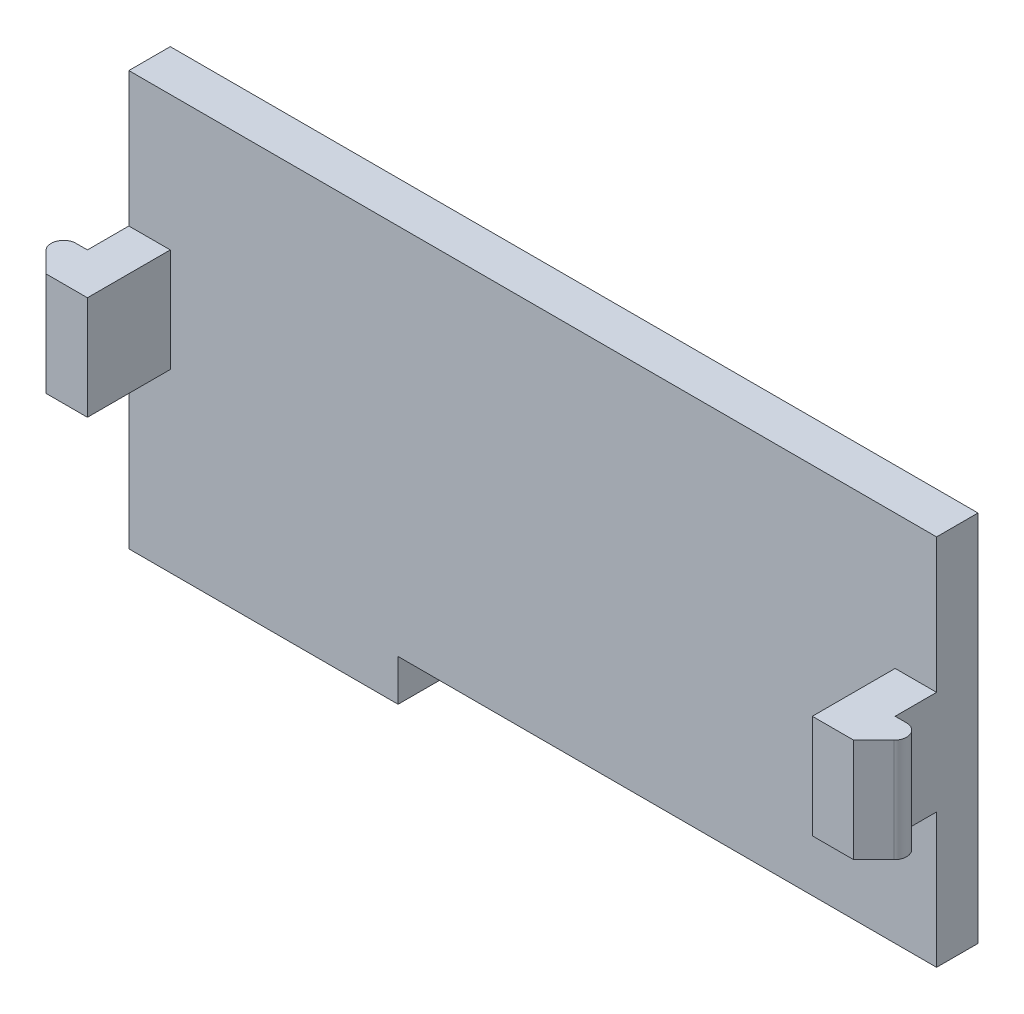
ISO-10303-21;
HEADER;
FILE_DESCRIPTION(('STEP AP214'),'2;1');
FILE_NAME('part.step','',(''),(''),'','','');
FILE_SCHEMA(('AUTOMOTIVE_DESIGN { 1 0 10303 214 1 1 1 1 }'));
ENDSEC;
DATA;
#1=APPLICATION_CONTEXT('core data for automotive mechanical design processes');
#2=APPLICATION_PROTOCOL_DEFINITION('international standard','automotive_design',2000,#1);
#3=PRODUCT_CONTEXT('',#1,'mechanical');
#4=PRODUCT('Part','Part','',(#3));
#5=PRODUCT_RELATED_PRODUCT_CATEGORY('part','',(#4));
#6=PRODUCT_DEFINITION_FORMATION('','',#4);
#7=PRODUCT_DEFINITION_CONTEXT('part definition',#1,'design');
#8=PRODUCT_DEFINITION('design','',#6,#7);
#9=PRODUCT_DEFINITION_SHAPE('','',#8);
#10=(LENGTH_UNIT() NAMED_UNIT(*) SI_UNIT(.MILLI.,.METRE.));
#11=(NAMED_UNIT(*) PLANE_ANGLE_UNIT() SI_UNIT($,.RADIAN.));
#12=(NAMED_UNIT(*) SI_UNIT($,.STERADIAN.) SOLID_ANGLE_UNIT());
#13=UNCERTAINTY_MEASURE_WITH_UNIT(LENGTH_MEASURE(1.E-05),#10,'distance_accuracy_value','');
#14=(GEOMETRIC_REPRESENTATION_CONTEXT(3) GLOBAL_UNCERTAINTY_ASSIGNED_CONTEXT((#13)) GLOBAL_UNIT_ASSIGNED_CONTEXT((#10,
#11,#12)) REPRESENTATION_CONTEXT('',''));
#15=CARTESIAN_POINT('',(0.,0.,0.));
#16=DIRECTION('',(0.,0.,1.));
#17=DIRECTION('',(1.,0.,0.));
#18=AXIS2_PLACEMENT_3D('',#15,#16,#17);
#19=CARTESIAN_POINT('',(0.,0.,2.));
#20=DIRECTION('',(0.,0.,1.));
#21=DIRECTION('',(1.,0.,0.));
#22=AXIS2_PLACEMENT_3D('',#19,#20,#21);
#23=PLANE('',#22);
#24=DIRECTION('',(0.,1.,0.));
#25=VECTOR('',#24,1.);
#26=CARTESIAN_POINT('',(14.,-20.,2.));
#27=LINE('',#26,#25);
#28=CARTESIAN_POINT('',(14.,-20.,2.));
#29=VERTEX_POINT('',#28);
#30=CARTESIAN_POINT('',(14.,-18.,2.));
#31=VERTEX_POINT('',#30);
#32=EDGE_CURVE('E177',#29,#31,#27,.T.);
#33=ORIENTED_EDGE('',*,*,#32,.T.);
#34=DIRECTION('',(1.,0.,0.));
#35=VECTOR('',#34,1.);
#36=CARTESIAN_POINT('',(0.,-18.,2.));
#37=LINE('',#36,#35);
#38=CARTESIAN_POINT('',(40.,-18.,2.));
#39=VERTEX_POINT('',#38);
#40=EDGE_CURVE('E54',#31,#39,#37,.T.);
#41=ORIENTED_EDGE('',*,*,#40,.T.);
#42=DIRECTION('',(0.,1.,0.));
#43=VECTOR('',#42,1.);
#44=CARTESIAN_POINT('',(40.,0.,2.));
#45=LINE('',#44,#43);
#46=CARTESIAN_POINT('',(40.,-11.5,2.));
#47=VERTEX_POINT('',#46);
#48=EDGE_CURVE('E299',#39,#47,#45,.T.);
#49=ORIENTED_EDGE('',*,*,#48,.T.);
#50=DIRECTION('',(1.,0.,0.));
#51=VECTOR('',#50,1.);
#52=CARTESIAN_POINT('',(40.,-11.5,2.));
#53=LINE('',#52,#51);
#54=CARTESIAN_POINT('',(38.,-11.5,2.));
#55=VERTEX_POINT('',#54);
#56=EDGE_CURVE('E262',#55,#47,#53,.T.);
#57=ORIENTED_EDGE('',*,*,#56,.F.);
#58=DIRECTION('',(0.,-1.,0.));
#59=VECTOR('',#58,1.);
#60=CARTESIAN_POINT('',(38.,-6.5,2.));
#61=LINE('',#60,#59);
#62=CARTESIAN_POINT('',(38.,-6.5,2.));
#63=VERTEX_POINT('',#62);
#64=EDGE_CURVE('E265',#63,#55,#61,.T.);
#65=ORIENTED_EDGE('',*,*,#64,.F.);
#66=DIRECTION('',(-1.,0.,0.));
#67=VECTOR('',#66,1.);
#68=CARTESIAN_POINT('',(40.,-6.5,2.));
#69=LINE('',#68,#67);
#70=CARTESIAN_POINT('',(40.,-6.5,2.));
#71=VERTEX_POINT('',#70);
#72=EDGE_CURVE('E268',#71,#63,#69,.T.);
#73=ORIENTED_EDGE('',*,*,#72,.F.);
#74=CARTESIAN_POINT('',(40.,0.,2.));
#75=VERTEX_POINT('',#74);
#76=EDGE_CURVE('E297',#71,#75,#45,.T.);
#77=ORIENTED_EDGE('',*,*,#76,.T.);
#78=DIRECTION('',(-1.,0.,0.));
#79=VECTOR('',#78,1.);
#80=CARTESIAN_POINT('',(0.,0.,2.));
#81=LINE('',#80,#79);
#82=CARTESIAN_POINT('',(1.,0.,2.));
#83=VERTEX_POINT('',#82);
#84=EDGE_CURVE('E301',#75,#83,#81,.T.);
#85=ORIENTED_EDGE('',*,*,#84,.T.);
#86=DIRECTION('',(0.,1.,0.));
#87=VECTOR('',#86,1.);
#88=CARTESIAN_POINT('',(1.,0.,2.));
#89=LINE('',#88,#87);
#90=CARTESIAN_POINT('',(1.,-6.5,2.));
#91=VERTEX_POINT('',#90);
#92=EDGE_CURVE('E201',#91,#83,#89,.T.);
#93=ORIENTED_EDGE('',*,*,#92,.F.);
#94=DIRECTION('',(-1.,0.,0.));
#95=VECTOR('',#94,1.);
#96=CARTESIAN_POINT('',(1.,-6.5,2.));
#97=LINE('',#96,#95);
#98=CARTESIAN_POINT('',(3.,-6.5,2.));
#99=VERTEX_POINT('',#98);
#100=EDGE_CURVE('E278',#99,#91,#97,.T.);
#101=ORIENTED_EDGE('',*,*,#100,.F.);
#102=DIRECTION('',(0.,1.,0.));
#103=VECTOR('',#102,1.);
#104=CARTESIAN_POINT('',(3.,-6.5,2.));
#105=LINE('',#104,#103);
#106=CARTESIAN_POINT('',(3.,-11.5,2.));
#107=VERTEX_POINT('',#106);
#108=EDGE_CURVE('E280',#107,#99,#105,.T.);
#109=ORIENTED_EDGE('',*,*,#108,.F.);
#110=DIRECTION('',(1.,0.,0.));
#111=VECTOR('',#110,1.);
#112=CARTESIAN_POINT('',(1.,-11.5,2.));
#113=LINE('',#112,#111);
#114=CARTESIAN_POINT('',(1.,-11.5,2.));
#115=VERTEX_POINT('',#114);
#116=EDGE_CURVE('E271',#115,#107,#113,.T.);
#117=ORIENTED_EDGE('',*,*,#116,.F.);
#118=CARTESIAN_POINT('',(1.,-20.,2.));
#119=VERTEX_POINT('',#118);
#120=EDGE_CURVE('E179',#119,#115,#89,.T.);
#121=ORIENTED_EDGE('',*,*,#120,.F.);
#122=DIRECTION('',(-1.,0.,0.));
#123=VECTOR('',#122,1.);
#124=CARTESIAN_POINT('',(0.,-20.,2.));
#125=LINE('',#124,#123);
#126=EDGE_CURVE('E174',#29,#119,#125,.T.);
#127=ORIENTED_EDGE('',*,*,#126,.F.);
#128=EDGE_LOOP('',(#33,#41,#49,#57,#65,#73,#77,#85,#93,#101,#109,#117,#121,#127));
#129=FACE_BOUND('',#128,.T.);
#130=ADVANCED_FACE('F39',(#129),#23,.T.);
#131=CARTESIAN_POINT('',(0.,-18.,2.));
#132=DIRECTION('',(0.,1.,0.));
#133=DIRECTION('',(0.,0.,1.));
#134=AXIS2_PLACEMENT_3D('',#131,#132,#133);
#135=PLANE('',#134);
#136=ORIENTED_EDGE('',*,*,#40,.F.);
#137=DIRECTION('',(0.,0.,1.));
#138=VECTOR('',#137,1.);
#139=CARTESIAN_POINT('',(14.,-18.,-2.23606797749979));
#140=LINE('',#139,#138);
#141=CARTESIAN_POINT('',(14.,-18.,0.));
#142=VERTEX_POINT('',#141);
#143=EDGE_CURVE('E58',#142,#31,#140,.T.);
#144=ORIENTED_EDGE('',*,*,#143,.F.);
#145=DIRECTION('',(1.,0.,0.));
#146=VECTOR('',#145,1.);
#147=CARTESIAN_POINT('',(0.,-18.,0.));
#148=LINE('',#147,#146);
#149=CARTESIAN_POINT('',(40.,-18.,0.));
#150=VERTEX_POINT('',#149);
#151=EDGE_CURVE('E295',#142,#150,#148,.T.);
#152=ORIENTED_EDGE('',*,*,#151,.T.);
#153=DIRECTION('',(0.,0.,-1.));
#154=VECTOR('',#153,1.);
#155=CARTESIAN_POINT('',(40.,-18.,2.));
#156=LINE('',#155,#154);
#157=EDGE_CURVE('E312',#39,#150,#156,.T.);
#158=ORIENTED_EDGE('',*,*,#157,.F.);
#159=EDGE_LOOP('',(#136,#144,#152,#158));
#160=FACE_BOUND('',#159,.T.);
#161=ADVANCED_FACE('F373',(#160),#135,.F.);
#162=CARTESIAN_POINT('',(40.,0.,2.));
#163=DIRECTION('',(-1.,0.,0.));
#164=DIRECTION('',(0.,0.,1.));
#165=AXIS2_PLACEMENT_3D('',#162,#163,#164);
#166=PLANE('',#165);
#167=DIRECTION('',(0.,1.,0.));
#168=VECTOR('',#167,1.);
#169=CARTESIAN_POINT('',(40.,0.,0.));
#170=LINE('',#169,#168);
#171=CARTESIAN_POINT('',(40.,0.,0.));
#172=VERTEX_POINT('',#171);
#173=EDGE_CURVE('E306',#150,#172,#170,.T.);
#174=ORIENTED_EDGE('',*,*,#173,.T.);
#175=DIRECTION('',(0.,0.,-1.));
#176=VECTOR('',#175,1.);
#177=CARTESIAN_POINT('',(40.,0.,2.));
#178=LINE('',#177,#176);
#179=EDGE_CURVE('E304',#75,#172,#178,.T.);
#180=ORIENTED_EDGE('',*,*,#179,.F.);
#181=ORIENTED_EDGE('',*,*,#76,.F.);
#182=DIRECTION('',(0.,0.,-1.));
#183=VECTOR('',#182,1.);
#184=CARTESIAN_POINT('',(40.,-6.5,4.));
#185=LINE('',#184,#183);
#186=CARTESIAN_POINT('',(40.,-6.5,4.));
#187=VERTEX_POINT('',#186);
#188=EDGE_CURVE('E238',#187,#71,#185,.T.);
#189=ORIENTED_EDGE('',*,*,#188,.F.);
#190=DIRECTION('',(0.,1.,0.));
#191=VECTOR('',#190,1.);
#192=CARTESIAN_POINT('',(40.,-6.5,4.));
#193=LINE('',#192,#191);
#194=CARTESIAN_POINT('',(40.,-11.5,4.));
#195=VERTEX_POINT('',#194);
#196=EDGE_CURVE('E261',#195,#187,#193,.T.);
#197=ORIENTED_EDGE('',*,*,#196,.F.);
#198=DIRECTION('',(0.,0.,-1.));
#199=VECTOR('',#198,1.);
#200=CARTESIAN_POINT('',(40.,-11.5,4.));
#201=LINE('',#200,#199);
#202=EDGE_CURVE('E258',#195,#47,#201,.T.);
#203=ORIENTED_EDGE('',*,*,#202,.T.);
#204=ORIENTED_EDGE('',*,*,#48,.F.);
#205=ORIENTED_EDGE('',*,*,#157,.T.);
#206=EDGE_LOOP('',(#174,#180,#181,#189,#197,#203,#204,#205));
#207=FACE_BOUND('',#206,.T.);
#208=ADVANCED_FACE('F380',(#207),#166,.F.);
#209=CARTESIAN_POINT('',(0.,0.,2.));
#210=DIRECTION('',(0.,-1.,0.));
#211=DIRECTION('',(0.,0.,-1.));
#212=AXIS2_PLACEMENT_3D('',#209,#210,#211);
#213=PLANE('',#212);
#214=DIRECTION('',(-1.,0.,0.));
#215=VECTOR('',#214,1.);
#216=CARTESIAN_POINT('',(0.,0.,0.));
#217=LINE('',#216,#215);
#218=CARTESIAN_POINT('',(1.,0.,0.));
#219=VERTEX_POINT('',#218);
#220=EDGE_CURVE('E298',#172,#219,#217,.T.);
#221=ORIENTED_EDGE('',*,*,#220,.T.);
#222=DIRECTION('',(0.,0.,1.));
#223=VECTOR('',#222,1.);
#224=CARTESIAN_POINT('',(1.,0.,-8.));
#225=LINE('',#224,#223);
#226=EDGE_CURVE('E200',#219,#83,#225,.T.);
#227=ORIENTED_EDGE('',*,*,#226,.T.);
#228=ORIENTED_EDGE('',*,*,#84,.F.);
#229=ORIENTED_EDGE('',*,*,#179,.T.);
#230=EDGE_LOOP('',(#221,#227,#228,#229));
#231=FACE_BOUND('',#230,.T.);
#232=ADVANCED_FACE('F387',(#231),#213,.F.);
#233=CARTESIAN_POINT('',(0.,0.,0.));
#234=DIRECTION('',(0.,0.,1.));
#235=DIRECTION('',(1.,0.,0.));
#236=AXIS2_PLACEMENT_3D('',#233,#234,#235);
#237=PLANE('',#236);
#238=ORIENTED_EDGE('',*,*,#151,.F.);
#239=DIRECTION('',(0.,-1.,0.));
#240=VECTOR('',#239,1.);
#241=CARTESIAN_POINT('',(14.,-20.,0.));
#242=LINE('',#241,#240);
#243=CARTESIAN_POINT('',(14.,-20.,0.));
#244=VERTEX_POINT('',#243);
#245=EDGE_CURVE('E197',#142,#244,#242,.T.);
#246=ORIENTED_EDGE('',*,*,#245,.T.);
#247=DIRECTION('',(-1.,0.,0.));
#248=VECTOR('',#247,1.);
#249=CARTESIAN_POINT('',(0.,-20.,0.));
#250=LINE('',#249,#248);
#251=CARTESIAN_POINT('',(1.,-20.,0.));
#252=VERTEX_POINT('',#251);
#253=EDGE_CURVE('E183',#244,#252,#250,.T.);
#254=ORIENTED_EDGE('',*,*,#253,.T.);
#255=DIRECTION('',(0.,1.,0.));
#256=VECTOR('',#255,1.);
#257=CARTESIAN_POINT('',(1.,0.,0.));
#258=LINE('',#257,#256);
#259=EDGE_CURVE('E204',#252,#219,#258,.T.);
#260=ORIENTED_EDGE('',*,*,#259,.T.);
#261=ORIENTED_EDGE('',*,*,#220,.F.);
#262=ORIENTED_EDGE('',*,*,#173,.F.);
#263=EDGE_LOOP('',(#238,#246,#254,#260,#261,#262));
#264=FACE_BOUND('',#263,.T.);
#265=ADVANCED_FACE('F385',(#264),#237,.F.);
#266=CARTESIAN_POINT('',(1.,-6.5,4.));
#267=DIRECTION('',(1.,0.,0.));
#268=DIRECTION('',(0.,1.,0.));
#269=AXIS2_PLACEMENT_3D('',#266,#267,#268);
#270=PLANE('',#269);
#271=DIRECTION('',(0.,0.,-1.));
#272=VECTOR('',#271,1.);
#273=CARTESIAN_POINT('',(1.,-6.5,4.));
#274=LINE('',#273,#272);
#275=CARTESIAN_POINT('',(1.,-6.5,4.));
#276=VERTEX_POINT('',#275);
#277=EDGE_CURVE('E277',#276,#91,#274,.T.);
#278=ORIENTED_EDGE('',*,*,#277,.T.);
#279=ORIENTED_EDGE('',*,*,#92,.T.);
#280=ORIENTED_EDGE('',*,*,#226,.F.);
#281=ORIENTED_EDGE('',*,*,#259,.F.);
#282=DIRECTION('',(0.,0.,1.));
#283=VECTOR('',#282,1.);
#284=CARTESIAN_POINT('',(1.,-20.,15.1529464379659));
#285=LINE('',#284,#283);
#286=EDGE_CURVE('E11',#252,#119,#285,.T.);
#287=ORIENTED_EDGE('',*,*,#286,.T.);
#288=ORIENTED_EDGE('',*,*,#120,.T.);
#289=DIRECTION('',(0.,0.,-1.));
#290=VECTOR('',#289,1.);
#291=CARTESIAN_POINT('',(1.,-11.5,4.));
#292=LINE('',#291,#290);
#293=CARTESIAN_POINT('',(1.,-11.5,4.));
#294=VERTEX_POINT('',#293);
#295=EDGE_CURVE('E292',#294,#115,#292,.T.);
#296=ORIENTED_EDGE('',*,*,#295,.F.);
#297=DIRECTION('',(0.,-1.,0.));
#298=VECTOR('',#297,1.);
#299=CARTESIAN_POINT('',(1.,-6.5,4.));
#300=LINE('',#299,#298);
#301=EDGE_CURVE('E274',#276,#294,#300,.T.);
#302=ORIENTED_EDGE('',*,*,#301,.F.);
#303=EDGE_LOOP('',(#278,#279,#280,#281,#287,#288,#296,#302));
#304=FACE_BOUND('',#303,.T.);
#305=ADVANCED_FACE('F351',(#304),#270,.F.);
#306=CARTESIAN_POINT('',(1.,-11.5,4.));
#307=DIRECTION('',(0.,1.,0.));
#308=DIRECTION('',(0.,0.,1.));
#309=AXIS2_PLACEMENT_3D('',#306,#307,#308);
#310=PLANE('',#309);
#311=DIRECTION('',(-0.707106781186548,0.,-0.707106781186547));
#312=VECTOR('',#311,1.);
#313=CARTESIAN_POINT('',(-0.999999999999996,-11.5,4.));
#314=LINE('',#313,#312);
#315=CARTESIAN_POINT('',(1.,-11.5,6.));
#316=VERTEX_POINT('',#315);
#317=CARTESIAN_POINT('',(0.0242640687119315,-11.5,5.02426406871193));
#318=VERTEX_POINT('',#317);
#319=EDGE_CURVE('E241',#316,#318,#314,.T.);
#320=ORIENTED_EDGE('',*,*,#319,.T.);
#321=CARTESIAN_POINT('',(0.44852813742386,-11.5,4.6));
#322=DIRECTION('',(0.,1.,0.));
#323=DIRECTION('',(0.,0.,1.));
#324=AXIS2_PLACEMENT_3D('',#321,#322,#323);
#325=CIRCLE('',#324,0.6);
#326=CARTESIAN_POINT('',(0.448528137423859,-11.5,4.));
#327=VERTEX_POINT('',#326);
#328=EDGE_CURVE('E327',#318,#327,#325,.F.);
#329=ORIENTED_EDGE('',*,*,#328,.T.);
#330=DIRECTION('',(1.,0.,0.));
#331=VECTOR('',#330,1.);
#332=CARTESIAN_POINT('',(0.,-11.5,4.));
#333=LINE('',#332,#331);
#334=EDGE_CURVE('E244',#327,#294,#333,.T.);
#335=ORIENTED_EDGE('',*,*,#334,.T.);
#336=ORIENTED_EDGE('',*,*,#295,.T.);
#337=ORIENTED_EDGE('',*,*,#116,.T.);
#338=DIRECTION('',(0.,0.,-1.));
#339=VECTOR('',#338,1.);
#340=CARTESIAN_POINT('',(3.,-11.5,4.));
#341=LINE('',#340,#339);
#342=CARTESIAN_POINT('',(3.,-11.5,6.));
#343=VERTEX_POINT('',#342);
#344=EDGE_CURVE('E289',#343,#107,#341,.T.);
#345=ORIENTED_EDGE('',*,*,#344,.F.);
#346=DIRECTION('',(-1.,0.,0.));
#347=VECTOR('',#346,1.);
#348=CARTESIAN_POINT('',(1.,-11.5,6.));
#349=LINE('',#348,#347);
#350=EDGE_CURVE('E225',#343,#316,#349,.T.);
#351=ORIENTED_EDGE('',*,*,#350,.T.);
#352=EDGE_LOOP('',(#320,#329,#335,#336,#337,#345,#351));
#353=FACE_BOUND('',#352,.T.);
#354=ADVANCED_FACE('F345',(#353),#310,.F.);
#355=CARTESIAN_POINT('',(3.,-6.5,4.));
#356=DIRECTION('',(-1.,0.,0.));
#357=DIRECTION('',(0.,-1.,0.));
#358=AXIS2_PLACEMENT_3D('',#355,#356,#357);
#359=PLANE('',#358);
#360=ORIENTED_EDGE('',*,*,#108,.T.);
#361=DIRECTION('',(0.,0.,-1.));
#362=VECTOR('',#361,1.);
#363=CARTESIAN_POINT('',(3.,-6.5,4.));
#364=LINE('',#363,#362);
#365=CARTESIAN_POINT('',(3.,-6.5,6.));
#366=VERTEX_POINT('',#365);
#367=EDGE_CURVE('E287',#366,#99,#364,.T.);
#368=ORIENTED_EDGE('',*,*,#367,.F.);
#369=DIRECTION('',(0.,-1.,0.));
#370=VECTOR('',#369,1.);
#371=CARTESIAN_POINT('',(3.,-2.02786404500042,6.));
#372=LINE('',#371,#370);
#373=EDGE_CURVE('E246',#366,#343,#372,.T.);
#374=ORIENTED_EDGE('',*,*,#373,.T.);
#375=ORIENTED_EDGE('',*,*,#344,.T.);
#376=EDGE_LOOP('',(#360,#368,#374,#375));
#377=FACE_BOUND('',#376,.T.);
#378=ADVANCED_FACE('F355',(#377),#359,.F.);
#379=CARTESIAN_POINT('',(1.,-6.5,4.));
#380=DIRECTION('',(0.,-1.,0.));
#381=DIRECTION('',(1.,0.,0.));
#382=AXIS2_PLACEMENT_3D('',#379,#380,#381);
#383=PLANE('',#382);
#384=DIRECTION('',(-1.,0.,0.));
#385=VECTOR('',#384,1.);
#386=CARTESIAN_POINT('',(0.,-6.5,4.));
#387=LINE('',#386,#385);
#388=CARTESIAN_POINT('',(0.448528137423859,-6.5,4.));
#389=VERTEX_POINT('',#388);
#390=EDGE_CURVE('E235',#276,#389,#387,.T.);
#391=ORIENTED_EDGE('',*,*,#390,.T.);
#392=CARTESIAN_POINT('',(0.44852813742386,-6.5,4.6));
#393=DIRECTION('',(0.,-1.,0.));
#394=DIRECTION('',(1.,0.,0.));
#395=AXIS2_PLACEMENT_3D('',#392,#393,#394);
#396=CIRCLE('',#395,0.6);
#397=CARTESIAN_POINT('',(0.0242640687119315,-6.5,5.02426406871193));
#398=VERTEX_POINT('',#397);
#399=EDGE_CURVE('E47',#389,#398,#396,.F.);
#400=ORIENTED_EDGE('',*,*,#399,.T.);
#401=DIRECTION('',(0.707106781186548,0.,0.707106781186547));
#402=VECTOR('',#401,1.);
#403=CARTESIAN_POINT('',(-0.999999999999996,-6.5,4.));
#404=LINE('',#403,#402);
#405=CARTESIAN_POINT('',(1.,-6.5,6.));
#406=VERTEX_POINT('',#405);
#407=EDGE_CURVE('E232',#398,#406,#404,.T.);
#408=ORIENTED_EDGE('',*,*,#407,.T.);
#409=DIRECTION('',(1.,0.,0.));
#410=VECTOR('',#409,1.);
#411=CARTESIAN_POINT('',(1.,-6.5,6.));
#412=LINE('',#411,#410);
#413=EDGE_CURVE('E229',#406,#366,#412,.T.);
#414=ORIENTED_EDGE('',*,*,#413,.T.);
#415=ORIENTED_EDGE('',*,*,#367,.T.);
#416=ORIENTED_EDGE('',*,*,#100,.T.);
#417=ORIENTED_EDGE('',*,*,#277,.F.);
#418=EDGE_LOOP('',(#391,#400,#408,#414,#415,#416,#417));
#419=FACE_BOUND('',#418,.T.);
#420=ADVANCED_FACE('F333',(#419),#383,.F.);
#421=CARTESIAN_POINT('',(40.,-6.5,4.));
#422=DIRECTION('',(0.,-1.,0.));
#423=DIRECTION('',(0.,0.,-1.));
#424=AXIS2_PLACEMENT_3D('',#421,#422,#423);
#425=PLANE('',#424);
#426=DIRECTION('',(0.707106781186548,0.,-0.707106781186547));
#427=VECTOR('',#426,1.);
#428=CARTESIAN_POINT('',(40.,-6.5,6.));
#429=LINE('',#428,#427);
#430=CARTESIAN_POINT('',(40.,-6.5,6.));
#431=VERTEX_POINT('',#430);
#432=CARTESIAN_POINT('',(40.9757359312881,-6.5,5.02426406871193));
#433=VERTEX_POINT('',#432);
#434=EDGE_CURVE('E217',#431,#433,#429,.T.);
#435=ORIENTED_EDGE('',*,*,#434,.T.);
#436=CARTESIAN_POINT('',(40.5514718625762,-6.5,4.6));
#437=DIRECTION('',(0.,-1.,0.));
#438=DIRECTION('',(0.,0.,-1.));
#439=AXIS2_PLACEMENT_3D('',#436,#437,#438);
#440=CIRCLE('',#439,0.6);
#441=CARTESIAN_POINT('',(40.5514718625762,-6.5,4.));
#442=VERTEX_POINT('',#441);
#443=EDGE_CURVE('E322',#433,#442,#440,.F.);
#444=ORIENTED_EDGE('',*,*,#443,.T.);
#445=DIRECTION('',(-1.,0.,0.));
#446=VECTOR('',#445,1.);
#447=CARTESIAN_POINT('',(42.,-6.5,4.));
#448=LINE('',#447,#446);
#449=EDGE_CURVE('E182',#442,#187,#448,.T.);
#450=ORIENTED_EDGE('',*,*,#449,.T.);
#451=ORIENTED_EDGE('',*,*,#188,.T.);
#452=ORIENTED_EDGE('',*,*,#72,.T.);
#453=DIRECTION('',(0.,0.,-1.));
#454=VECTOR('',#453,1.);
#455=CARTESIAN_POINT('',(38.,-6.5,4.));
#456=LINE('',#455,#454);
#457=CARTESIAN_POINT('',(38.,-6.5,6.));
#458=VERTEX_POINT('',#457);
#459=EDGE_CURVE('E252',#458,#63,#456,.T.);
#460=ORIENTED_EDGE('',*,*,#459,.F.);
#461=DIRECTION('',(1.,0.,0.));
#462=VECTOR('',#461,1.);
#463=CARTESIAN_POINT('',(38.,-6.5,6.));
#464=LINE('',#463,#462);
#465=EDGE_CURVE('E209',#458,#431,#464,.T.);
#466=ORIENTED_EDGE('',*,*,#465,.T.);
#467=EDGE_LOOP('',(#435,#444,#450,#451,#452,#460,#466));
#468=FACE_BOUND('',#467,.T.);
#469=ADVANCED_FACE('F408',(#468),#425,.F.);
#470=CARTESIAN_POINT('',(38.,-6.5,4.));
#471=DIRECTION('',(1.,0.,0.));
#472=DIRECTION('',(0.,0.,-1.));
#473=AXIS2_PLACEMENT_3D('',#470,#471,#472);
#474=PLANE('',#473);
#475=ORIENTED_EDGE('',*,*,#64,.T.);
#476=DIRECTION('',(0.,0.,-1.));
#477=VECTOR('',#476,1.);
#478=CARTESIAN_POINT('',(38.,-11.5,4.));
#479=LINE('',#478,#477);
#480=CARTESIAN_POINT('',(38.,-11.5,6.));
#481=VERTEX_POINT('',#480);
#482=EDGE_CURVE('E255',#481,#55,#479,.T.);
#483=ORIENTED_EDGE('',*,*,#482,.F.);
#484=DIRECTION('',(0.,-1.,0.));
#485=VECTOR('',#484,1.);
#486=CARTESIAN_POINT('',(38.,-2.02786404500042,6.));
#487=LINE('',#486,#485);
#488=EDGE_CURVE('E214',#458,#481,#487,.T.);
#489=ORIENTED_EDGE('',*,*,#488,.F.);
#490=ORIENTED_EDGE('',*,*,#459,.T.);
#491=EDGE_LOOP('',(#475,#483,#489,#490));
#492=FACE_BOUND('',#491,.T.);
#493=ADVANCED_FACE('F419',(#492),#474,.F.);
#494=CARTESIAN_POINT('',(40.,-11.5,4.));
#495=DIRECTION('',(0.,1.,0.));
#496=DIRECTION('',(-1.,0.,0.));
#497=AXIS2_PLACEMENT_3D('',#494,#495,#496);
#498=PLANE('',#497);
#499=DIRECTION('',(1.,0.,0.));
#500=VECTOR('',#499,1.);
#501=CARTESIAN_POINT('',(42.,-11.5,4.));
#502=LINE('',#501,#500);
#503=CARTESIAN_POINT('',(40.5514718625762,-11.5,4.));
#504=VERTEX_POINT('',#503);
#505=EDGE_CURVE('E222',#195,#504,#502,.T.);
#506=ORIENTED_EDGE('',*,*,#505,.T.);
#507=CARTESIAN_POINT('',(40.5514718625762,-11.5,4.6));
#508=DIRECTION('',(0.,1.,0.));
#509=DIRECTION('',(-1.,0.,0.));
#510=AXIS2_PLACEMENT_3D('',#507,#508,#509);
#511=CIRCLE('',#510,0.6);
#512=CARTESIAN_POINT('',(40.9757359312881,-11.5,5.02426406871193));
#513=VERTEX_POINT('',#512);
#514=EDGE_CURVE('E318',#504,#513,#511,.F.);
#515=ORIENTED_EDGE('',*,*,#514,.T.);
#516=DIRECTION('',(-0.707106781186548,0.,0.707106781186547));
#517=VECTOR('',#516,1.);
#518=CARTESIAN_POINT('',(40.,-11.5,6.));
#519=LINE('',#518,#517);
#520=CARTESIAN_POINT('',(40.,-11.5,6.));
#521=VERTEX_POINT('',#520);
#522=EDGE_CURVE('E220',#513,#521,#519,.T.);
#523=ORIENTED_EDGE('',*,*,#522,.T.);
#524=DIRECTION('',(-1.,0.,0.));
#525=VECTOR('',#524,1.);
#526=CARTESIAN_POINT('',(38.,-11.5,6.));
#527=LINE('',#526,#525);
#528=EDGE_CURVE('E213',#521,#481,#527,.T.);
#529=ORIENTED_EDGE('',*,*,#528,.T.);
#530=ORIENTED_EDGE('',*,*,#482,.T.);
#531=ORIENTED_EDGE('',*,*,#56,.T.);
#532=ORIENTED_EDGE('',*,*,#202,.F.);
#533=EDGE_LOOP('',(#506,#515,#523,#529,#530,#531,#532));
#534=FACE_BOUND('',#533,.T.);
#535=ADVANCED_FACE('F423',(#534),#498,.F.);
#536=CARTESIAN_POINT('',(0.,-2.02786404500042,4.));
#537=DIRECTION('',(0.,0.,-1.));
#538=DIRECTION('',(-1.,0.,0.));
#539=AXIS2_PLACEMENT_3D('',#536,#537,#538);
#540=PLANE('',#539);
#541=ORIENTED_EDGE('',*,*,#334,.F.);
#542=DIRECTION('',(0.,-1.,0.));
#543=VECTOR('',#542,1.);
#544=CARTESIAN_POINT('',(0.448528137423859,-2.02786404500042,4.));
#545=LINE('',#544,#543);
#546=EDGE_CURVE('E329',#327,#389,#545,.F.);
#547=ORIENTED_EDGE('',*,*,#546,.T.);
#548=ORIENTED_EDGE('',*,*,#390,.F.);
#549=ORIENTED_EDGE('',*,*,#301,.T.);
#550=EDGE_LOOP('',(#541,#547,#548,#549));
#551=FACE_BOUND('',#550,.T.);
#552=ADVANCED_FACE('F348',(#551),#540,.T.);
#553=CARTESIAN_POINT('',(-0.999999999999996,-2.02786404500042,4.));
#554=DIRECTION('',(-0.707106781186547,0.,0.707106781186548));
#555=DIRECTION('',(0.707106781186548,0.,0.707106781186547));
#556=AXIS2_PLACEMENT_3D('',#553,#554,#555);
#557=PLANE('',#556);
#558=ORIENTED_EDGE('',*,*,#407,.F.);
#559=DIRECTION('',(0.,-1.,0.));
#560=VECTOR('',#559,1.);
#561=CARTESIAN_POINT('',(0.0242640687119315,-2.02786404500042,5.02426406871193));
#562=LINE('',#561,#560);
#563=EDGE_CURVE('E324',#398,#318,#562,.T.);
#564=ORIENTED_EDGE('',*,*,#563,.T.);
#565=ORIENTED_EDGE('',*,*,#319,.F.);
#566=DIRECTION('',(0.,-1.,0.));
#567=VECTOR('',#566,1.);
#568=CARTESIAN_POINT('',(1.,-2.02786404500042,6.));
#569=LINE('',#568,#567);
#570=EDGE_CURVE('E233',#406,#316,#569,.T.);
#571=ORIENTED_EDGE('',*,*,#570,.F.);
#572=EDGE_LOOP('',(#558,#564,#565,#571));
#573=FACE_BOUND('',#572,.T.);
#574=ADVANCED_FACE('F341',(#573),#557,.T.);
#575=CARTESIAN_POINT('',(1.,-2.02786404500042,6.));
#576=DIRECTION('',(0.,0.,1.));
#577=DIRECTION('',(1.,0.,0.));
#578=AXIS2_PLACEMENT_3D('',#575,#576,#577);
#579=PLANE('',#578);
#580=ORIENTED_EDGE('',*,*,#413,.F.);
#581=ORIENTED_EDGE('',*,*,#570,.T.);
#582=ORIENTED_EDGE('',*,*,#350,.F.);
#583=ORIENTED_EDGE('',*,*,#373,.F.);
#584=EDGE_LOOP('',(#580,#581,#582,#583));
#585=FACE_BOUND('',#584,.T.);
#586=ADVANCED_FACE('F359',(#585),#579,.T.);
#587=CARTESIAN_POINT('',(38.,-2.02786404500042,6.));
#588=DIRECTION('',(0.,0.,1.));
#589=DIRECTION('',(1.,0.,0.));
#590=AXIS2_PLACEMENT_3D('',#587,#588,#589);
#591=PLANE('',#590);
#592=ORIENTED_EDGE('',*,*,#465,.F.);
#593=ORIENTED_EDGE('',*,*,#488,.T.);
#594=ORIENTED_EDGE('',*,*,#528,.F.);
#595=DIRECTION('',(0.,-1.,0.));
#596=VECTOR('',#595,1.);
#597=CARTESIAN_POINT('',(40.,-2.02786404500042,6.));
#598=LINE('',#597,#596);
#599=EDGE_CURVE('E210',#431,#521,#598,.T.);
#600=ORIENTED_EDGE('',*,*,#599,.F.);
#601=EDGE_LOOP('',(#592,#593,#594,#600));
#602=FACE_BOUND('',#601,.T.);
#603=ADVANCED_FACE('F361',(#602),#591,.T.);
#604=CARTESIAN_POINT('',(40.,-2.02786404500042,6.));
#605=DIRECTION('',(0.707106781186547,0.,0.707106781186548));
#606=DIRECTION('',(0.707106781186548,0.,-0.707106781186547));
#607=AXIS2_PLACEMENT_3D('',#604,#605,#606);
#608=PLANE('',#607);
#609=ORIENTED_EDGE('',*,*,#522,.F.);
#610=DIRECTION('',(0.,-1.,0.));
#611=VECTOR('',#610,1.);
#612=CARTESIAN_POINT('',(40.9757359312881,-2.02786404500042,5.02426406871193));
#613=LINE('',#612,#611);
#614=EDGE_CURVE('E320',#513,#433,#613,.F.);
#615=ORIENTED_EDGE('',*,*,#614,.T.);
#616=ORIENTED_EDGE('',*,*,#434,.F.);
#617=ORIENTED_EDGE('',*,*,#599,.T.);
#618=EDGE_LOOP('',(#609,#615,#616,#617));
#619=FACE_BOUND('',#618,.T.);
#620=ADVANCED_FACE('F367',(#619),#608,.T.);
#621=CARTESIAN_POINT('',(42.,-2.02786404500042,4.));
#622=DIRECTION('',(0.,0.,-1.));
#623=DIRECTION('',(-1.,0.,0.));
#624=AXIS2_PLACEMENT_3D('',#621,#622,#623);
#625=PLANE('',#624);
#626=ORIENTED_EDGE('',*,*,#449,.F.);
#627=DIRECTION('',(0.,-1.,0.));
#628=VECTOR('',#627,1.);
#629=CARTESIAN_POINT('',(40.5514718625762,-2.02786404500042,4.));
#630=LINE('',#629,#628);
#631=EDGE_CURVE('E315',#442,#504,#630,.T.);
#632=ORIENTED_EDGE('',*,*,#631,.T.);
#633=ORIENTED_EDGE('',*,*,#505,.F.);
#634=ORIENTED_EDGE('',*,*,#196,.T.);
#635=EDGE_LOOP('',(#626,#632,#633,#634));
#636=FACE_BOUND('',#635,.T.);
#637=ADVANCED_FACE('F396',(#636),#625,.T.);
#638=CARTESIAN_POINT('',(40.5514718625762,-2.02786404500042,4.6));
#639=DIRECTION('',(0.,-1.,0.));
#640=DIRECTION('',(0.,0.,-1.));
#641=AXIS2_PLACEMENT_3D('',#638,#639,#640);
#642=CYLINDRICAL_SURFACE('',#641,0.6);
#643=ORIENTED_EDGE('',*,*,#443,.F.);
#644=ORIENTED_EDGE('',*,*,#614,.F.);
#645=ORIENTED_EDGE('',*,*,#514,.F.);
#646=ORIENTED_EDGE('',*,*,#631,.F.);
#647=EDGE_LOOP('',(#643,#644,#645,#646));
#648=FACE_BOUND('',#647,.T.);
#649=ADVANCED_FACE('F394',(#648),#642,.T.);
#650=CARTESIAN_POINT('',(0.44852813742386,-2.02786404500042,4.6));
#651=DIRECTION('',(0.,-1.,0.));
#652=DIRECTION('',(0.,0.,-1.));
#653=AXIS2_PLACEMENT_3D('',#650,#651,#652);
#654=CYLINDRICAL_SURFACE('',#653,0.6);
#655=ORIENTED_EDGE('',*,*,#399,.F.);
#656=ORIENTED_EDGE('',*,*,#546,.F.);
#657=ORIENTED_EDGE('',*,*,#328,.F.);
#658=ORIENTED_EDGE('',*,*,#563,.F.);
#659=EDGE_LOOP('',(#655,#656,#657,#658));
#660=FACE_BOUND('',#659,.T.);
#661=ADVANCED_FACE('F41',(#660),#654,.T.);
#662=CARTESIAN_POINT('',(0.,-20.,15.1529464379659));
#663=DIRECTION('',(0.,-1.,0.));
#664=DIRECTION('',(0.,0.,-1.));
#665=AXIS2_PLACEMENT_3D('',#662,#663,#664);
#666=PLANE('',#665);
#667=ORIENTED_EDGE('',*,*,#286,.F.);
#668=ORIENTED_EDGE('',*,*,#253,.F.);
#669=DIRECTION('',(0.,0.,1.));
#670=VECTOR('',#669,1.);
#671=CARTESIAN_POINT('',(14.,-20.,-2.23606797749979));
#672=LINE('',#671,#670);
#673=EDGE_CURVE('E186',#244,#29,#672,.T.);
#674=ORIENTED_EDGE('',*,*,#673,.T.);
#675=ORIENTED_EDGE('',*,*,#126,.T.);
#676=EDGE_LOOP('',(#667,#668,#674,#675));
#677=FACE_BOUND('',#676,.T.);
#678=ADVANCED_FACE('F187',(#677),#666,.T.);
#679=CARTESIAN_POINT('',(14.,-20.,-2.23606797749979));
#680=DIRECTION('',(1.,0.,0.));
#681=DIRECTION('',(0.,0.,-1.));
#682=AXIS2_PLACEMENT_3D('',#679,#680,#681);
#683=PLANE('',#682);
#684=ORIENTED_EDGE('',*,*,#245,.F.);
#685=ORIENTED_EDGE('',*,*,#143,.T.);
#686=ORIENTED_EDGE('',*,*,#32,.F.);
#687=ORIENTED_EDGE('',*,*,#673,.F.);
#688=EDGE_LOOP('',(#684,#685,#686,#687));
#689=FACE_BOUND('',#688,.T.);
#690=ADVANCED_FACE('F193',(#689),#683,.T.);
#691=CLOSED_SHELL('',(#130,#161,#208,#232,#265,#305,#354,#378,#420,#469,#493,#535,#552,#574,
#586,#603,#620,#637,#649,#661,#678,#690));
#692=MANIFOLD_SOLID_BREP('B2',#691);
#693=ADVANCED_BREP_SHAPE_REPRESENTATION('',(#18,#692),#14);
#694=SHAPE_DEFINITION_REPRESENTATION(#9,#693);
ENDSEC;
END-ISO-10303-21;
